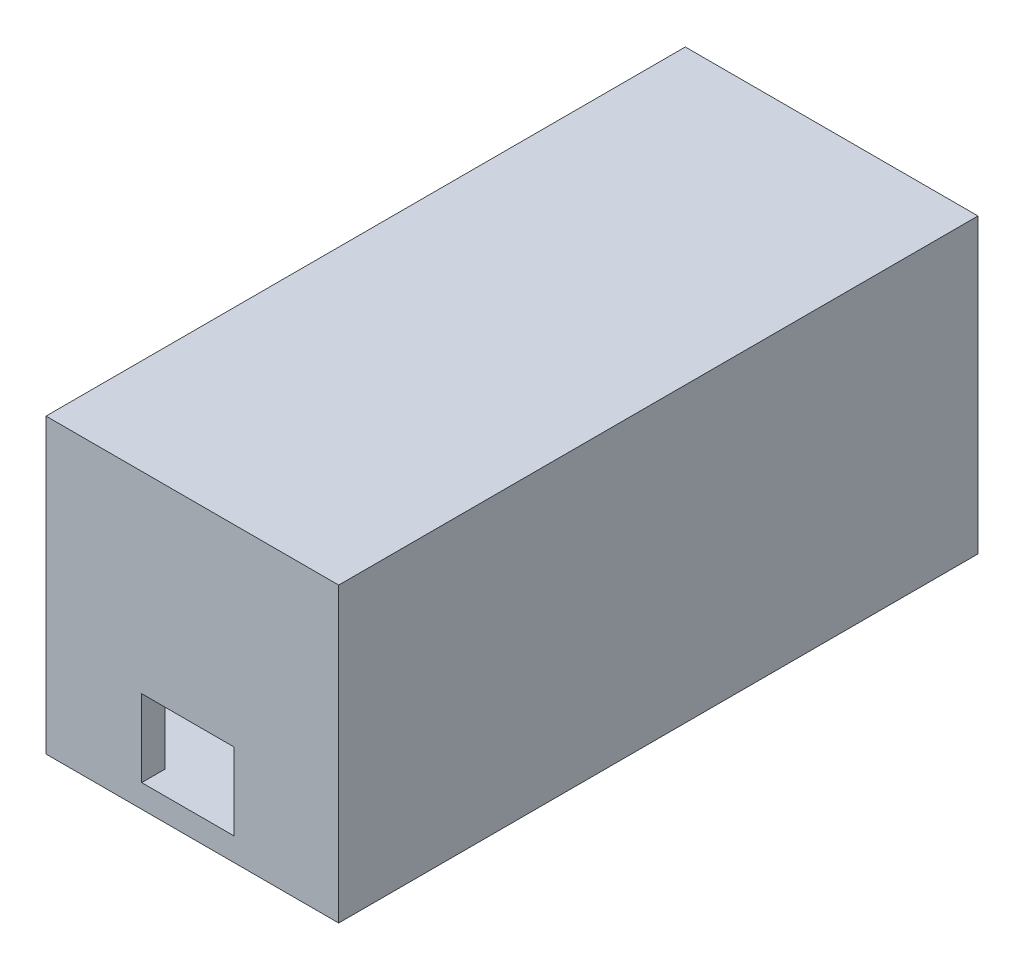
ISO-10303-21;
HEADER;
FILE_DESCRIPTION(('STEP AP214'),'2;1');
FILE_NAME('part.step','',(''),(''),'','','');
FILE_SCHEMA(('AUTOMOTIVE_DESIGN { 1 0 10303 214 1 1 1 1 }'));
ENDSEC;
DATA;
#1=APPLICATION_CONTEXT('core data for automotive mechanical design processes');
#2=APPLICATION_PROTOCOL_DEFINITION('international standard','automotive_design',2000,#1);
#3=PRODUCT_CONTEXT('',#1,'mechanical');
#4=PRODUCT('Part','Part','',(#3));
#5=PRODUCT_RELATED_PRODUCT_CATEGORY('part','',(#4));
#6=PRODUCT_DEFINITION_FORMATION('','',#4);
#7=PRODUCT_DEFINITION_CONTEXT('part definition',#1,'design');
#8=PRODUCT_DEFINITION('design','',#6,#7);
#9=PRODUCT_DEFINITION_SHAPE('','',#8);
#10=(LENGTH_UNIT() NAMED_UNIT(*) SI_UNIT(.MILLI.,.METRE.));
#11=(NAMED_UNIT(*) PLANE_ANGLE_UNIT() SI_UNIT($,.RADIAN.));
#12=(NAMED_UNIT(*) SI_UNIT($,.STERADIAN.) SOLID_ANGLE_UNIT());
#13=UNCERTAINTY_MEASURE_WITH_UNIT(LENGTH_MEASURE(1.E-05),#10,'distance_accuracy_value','');
#14=(GEOMETRIC_REPRESENTATION_CONTEXT(3) GLOBAL_UNCERTAINTY_ASSIGNED_CONTEXT((#13)) GLOBAL_UNIT_ASSIGNED_CONTEXT((#10,
#11,#12)) REPRESENTATION_CONTEXT('',''));
#15=CARTESIAN_POINT('',(0.,0.,0.));
#16=DIRECTION('',(0.,0.,1.));
#17=DIRECTION('',(1.,0.,0.));
#18=AXIS2_PLACEMENT_3D('',#15,#16,#17);
#19=CARTESIAN_POINT('',(0.,0.,0.));
#20=DIRECTION('',(0.,0.,-1.));
#21=DIRECTION('',(-1.,0.,0.));
#22=AXIS2_PLACEMENT_3D('',#19,#20,#21);
#23=PLANE('',#22);
#24=DIRECTION('',(0.,-1.,0.));
#25=VECTOR('',#24,1.);
#26=CARTESIAN_POINT('',(0.,0.,0.));
#27=LINE('',#26,#25);
#28=CARTESIAN_POINT('',(0.,19.,0.));
#29=VERTEX_POINT('',#28);
#30=CARTESIAN_POINT('',(0.,0.,0.));
#31=VERTEX_POINT('',#30);
#32=EDGE_CURVE('E210',#29,#31,#27,.T.);
#33=ORIENTED_EDGE('',*,*,#32,.F.);
#34=DIRECTION('',(-1.,0.,0.));
#35=VECTOR('',#34,1.);
#36=CARTESIAN_POINT('',(0.,19.,0.));
#37=LINE('',#36,#35);
#38=CARTESIAN_POINT('',(19.,19.,0.));
#39=VERTEX_POINT('',#38);
#40=EDGE_CURVE('E58',#39,#29,#37,.T.);
#41=ORIENTED_EDGE('',*,*,#40,.F.);
#42=DIRECTION('',(0.,1.,0.));
#43=VECTOR('',#42,1.);
#44=CARTESIAN_POINT('',(19.,0.,0.));
#45=LINE('',#44,#43);
#46=CARTESIAN_POINT('',(19.,0.,0.));
#47=VERTEX_POINT('',#46);
#48=EDGE_CURVE('E215',#47,#39,#45,.T.);
#49=ORIENTED_EDGE('',*,*,#48,.F.);
#50=DIRECTION('',(1.,0.,0.));
#51=VECTOR('',#50,1.);
#52=CARTESIAN_POINT('',(0.,0.,0.));
#53=LINE('',#52,#51);
#54=EDGE_CURVE('E213',#31,#47,#53,.T.);
#55=ORIENTED_EDGE('',*,*,#54,.F.);
#56=EDGE_LOOP('',(#33,#41,#49,#55));
#57=FACE_BOUND('',#56,.T.);
#58=DIRECTION('',(-1.,0.,0.));
#59=VECTOR('',#58,1.);
#60=CARTESIAN_POINT('',(1.5,17.5,0.));
#61=LINE('',#60,#59);
#62=CARTESIAN_POINT('',(17.5,17.5,0.));
#63=VERTEX_POINT('',#62);
#64=CARTESIAN_POINT('',(1.5,17.5,0.));
#65=VERTEX_POINT('',#64);
#66=EDGE_CURVE('E185',#63,#65,#61,.T.);
#67=ORIENTED_EDGE('',*,*,#66,.T.);
#68=DIRECTION('',(0.,-1.,0.));
#69=VECTOR('',#68,1.);
#70=CARTESIAN_POINT('',(1.5,1.5,0.));
#71=LINE('',#70,#69);
#72=CARTESIAN_POINT('',(1.5,1.5,0.));
#73=VERTEX_POINT('',#72);
#74=EDGE_CURVE('E50',#65,#73,#71,.T.);
#75=ORIENTED_EDGE('',*,*,#74,.T.);
#76=DIRECTION('',(1.,0.,0.));
#77=VECTOR('',#76,1.);
#78=CARTESIAN_POINT('',(1.5,1.5,0.));
#79=LINE('',#78,#77);
#80=CARTESIAN_POINT('',(17.5,1.5,0.));
#81=VERTEX_POINT('',#80);
#82=EDGE_CURVE('E195',#73,#81,#79,.T.);
#83=ORIENTED_EDGE('',*,*,#82,.T.);
#84=DIRECTION('',(0.,1.,0.));
#85=VECTOR('',#84,1.);
#86=CARTESIAN_POINT('',(17.5,1.5,0.));
#87=LINE('',#86,#85);
#88=EDGE_CURVE('E198',#81,#63,#87,.T.);
#89=ORIENTED_EDGE('',*,*,#88,.T.);
#90=EDGE_LOOP('',(#67,#75,#83,#89));
#91=FACE_BOUND('',#90,.T.);
#92=ADVANCED_FACE('F35',(#57,#91),#23,.T.);
#93=CARTESIAN_POINT('',(0.,0.,40.));
#94=DIRECTION('',(1.,0.,0.));
#95=DIRECTION('',(0.,1.,0.));
#96=AXIS2_PLACEMENT_3D('',#93,#94,#95);
#97=PLANE('',#96);
#98=ORIENTED_EDGE('',*,*,#32,.T.);
#99=DIRECTION('',(0.,0.,-1.));
#100=VECTOR('',#99,1.);
#101=CARTESIAN_POINT('',(0.,0.,40.));
#102=LINE('',#101,#100);
#103=CARTESIAN_POINT('',(0.,0.,41.5));
#104=VERTEX_POINT('',#103);
#105=EDGE_CURVE('E11',#104,#31,#102,.T.);
#106=ORIENTED_EDGE('',*,*,#105,.F.);
#107=DIRECTION('',(0.,-1.,0.));
#108=VECTOR('',#107,1.);
#109=CARTESIAN_POINT('',(0.,19.,41.5));
#110=LINE('',#109,#108);
#111=CARTESIAN_POINT('',(0.,19.,41.5));
#112=VERTEX_POINT('',#111);
#113=EDGE_CURVE('E147',#112,#104,#110,.T.);
#114=ORIENTED_EDGE('',*,*,#113,.F.);
#115=DIRECTION('',(0.,0.,-1.));
#116=VECTOR('',#115,1.);
#117=CARTESIAN_POINT('',(0.,19.,40.));
#118=LINE('',#117,#116);
#119=EDGE_CURVE('E218',#112,#29,#118,.T.);
#120=ORIENTED_EDGE('',*,*,#119,.T.);
#121=EDGE_LOOP('',(#98,#106,#114,#120));
#122=FACE_BOUND('',#121,.T.);
#123=ADVANCED_FACE('F37',(#122),#97,.F.);
#124=CARTESIAN_POINT('',(0.,0.,40.));
#125=DIRECTION('',(0.,1.,0.));
#126=DIRECTION('',(0.,0.,1.));
#127=AXIS2_PLACEMENT_3D('',#124,#125,#126);
#128=PLANE('',#127);
#129=ORIENTED_EDGE('',*,*,#54,.T.);
#130=DIRECTION('',(0.,0.,-1.));
#131=VECTOR('',#130,1.);
#132=CARTESIAN_POINT('',(19.,0.,40.));
#133=LINE('',#132,#131);
#134=CARTESIAN_POINT('',(19.,0.,41.5));
#135=VERTEX_POINT('',#134);
#136=EDGE_CURVE('E43',#135,#47,#133,.T.);
#137=ORIENTED_EDGE('',*,*,#136,.F.);
#138=DIRECTION('',(1.,0.,0.));
#139=VECTOR('',#138,1.);
#140=CARTESIAN_POINT('',(0.,0.,41.5));
#141=LINE('',#140,#139);
#142=EDGE_CURVE('E172',#104,#135,#141,.T.);
#143=ORIENTED_EDGE('',*,*,#142,.F.);
#144=ORIENTED_EDGE('',*,*,#105,.T.);
#145=EDGE_LOOP('',(#129,#137,#143,#144));
#146=FACE_BOUND('',#145,.T.);
#147=ADVANCED_FACE('F236',(#146),#128,.F.);
#148=CARTESIAN_POINT('',(19.,0.,40.));
#149=DIRECTION('',(-1.,0.,0.));
#150=DIRECTION('',(0.,-1.,0.));
#151=AXIS2_PLACEMENT_3D('',#148,#149,#150);
#152=PLANE('',#151);
#153=ORIENTED_EDGE('',*,*,#48,.T.);
#154=DIRECTION('',(0.,0.,-1.));
#155=VECTOR('',#154,1.);
#156=CARTESIAN_POINT('',(19.,19.,40.));
#157=LINE('',#156,#155);
#158=CARTESIAN_POINT('',(19.,19.,41.5));
#159=VERTEX_POINT('',#158);
#160=EDGE_CURVE('E220',#159,#39,#157,.T.);
#161=ORIENTED_EDGE('',*,*,#160,.F.);
#162=DIRECTION('',(0.,1.,0.));
#163=VECTOR('',#162,1.);
#164=CARTESIAN_POINT('',(19.,19.,41.5));
#165=LINE('',#164,#163);
#166=EDGE_CURVE('E175',#135,#159,#165,.T.);
#167=ORIENTED_EDGE('',*,*,#166,.F.);
#168=ORIENTED_EDGE('',*,*,#136,.T.);
#169=EDGE_LOOP('',(#153,#161,#167,#168));
#170=FACE_BOUND('',#169,.T.);
#171=ADVANCED_FACE('F225',(#170),#152,.F.);
#172=CARTESIAN_POINT('',(0.,19.,40.));
#173=DIRECTION('',(0.,-1.,0.));
#174=DIRECTION('',(0.,0.,-1.));
#175=AXIS2_PLACEMENT_3D('',#172,#173,#174);
#176=PLANE('',#175);
#177=ORIENTED_EDGE('',*,*,#40,.T.);
#178=ORIENTED_EDGE('',*,*,#119,.F.);
#179=DIRECTION('',(-1.,0.,0.));
#180=VECTOR('',#179,1.);
#181=CARTESIAN_POINT('',(0.,19.,41.5));
#182=LINE('',#181,#180);
#183=EDGE_CURVE('E178',#159,#112,#182,.T.);
#184=ORIENTED_EDGE('',*,*,#183,.F.);
#185=ORIENTED_EDGE('',*,*,#160,.T.);
#186=EDGE_LOOP('',(#177,#178,#184,#185));
#187=FACE_BOUND('',#186,.T.);
#188=ADVANCED_FACE('F234',(#187),#176,.F.);
#189=CARTESIAN_POINT('',(1.5,1.5,40.));
#190=DIRECTION('',(1.,0.,0.));
#191=DIRECTION('',(0.,0.,-1.));
#192=AXIS2_PLACEMENT_3D('',#189,#190,#191);
#193=PLANE('',#192);
#194=ORIENTED_EDGE('',*,*,#74,.F.);
#195=DIRECTION('',(0.,0.,-1.));
#196=VECTOR('',#195,1.);
#197=CARTESIAN_POINT('',(1.5,17.5,40.));
#198=LINE('',#197,#196);
#199=CARTESIAN_POINT('',(1.5,17.5,40.));
#200=VERTEX_POINT('',#199);
#201=EDGE_CURVE('E193',#200,#65,#198,.T.);
#202=ORIENTED_EDGE('',*,*,#201,.F.);
#203=DIRECTION('',(0.,-1.,0.));
#204=VECTOR('',#203,1.);
#205=CARTESIAN_POINT('',(1.5,1.5,40.));
#206=LINE('',#205,#204);
#207=CARTESIAN_POINT('',(1.5,1.5,40.));
#208=VERTEX_POINT('',#207);
#209=EDGE_CURVE('E181',#200,#208,#206,.T.);
#210=ORIENTED_EDGE('',*,*,#209,.T.);
#211=DIRECTION('',(0.,0.,-1.));
#212=VECTOR('',#211,1.);
#213=CARTESIAN_POINT('',(1.5,1.5,40.));
#214=LINE('',#213,#212);
#215=EDGE_CURVE('E208',#208,#73,#214,.T.);
#216=ORIENTED_EDGE('',*,*,#215,.T.);
#217=EDGE_LOOP('',(#194,#202,#210,#216));
#218=FACE_BOUND('',#217,.T.);
#219=ADVANCED_FACE('F249',(#218),#193,.T.);
#220=CARTESIAN_POINT('',(1.5,1.5,40.));
#221=DIRECTION('',(0.,1.,0.));
#222=DIRECTION('',(0.,0.,1.));
#223=AXIS2_PLACEMENT_3D('',#220,#221,#222);
#224=PLANE('',#223);
#225=ORIENTED_EDGE('',*,*,#82,.F.);
#226=ORIENTED_EDGE('',*,*,#215,.F.);
#227=DIRECTION('',(1.,0.,0.));
#228=VECTOR('',#227,1.);
#229=CARTESIAN_POINT('',(1.5,1.5,40.));
#230=LINE('',#229,#228);
#231=CARTESIAN_POINT('',(6.21099258066499,1.5,40.));
#232=VERTEX_POINT('',#231);
#233=EDGE_CURVE('E146',#208,#232,#230,.T.);
#234=ORIENTED_EDGE('',*,*,#233,.T.);
#235=DIRECTION('',(0.,0.,-1.));
#236=VECTOR('',#235,1.);
#237=CARTESIAN_POINT('',(6.21099258066499,1.5,41.5));
#238=LINE('',#237,#236);
#239=CARTESIAN_POINT('',(6.21099258066499,1.5,41.5));
#240=VERTEX_POINT('',#239);
#241=EDGE_CURVE('E130',#240,#232,#238,.T.);
#242=ORIENTED_EDGE('',*,*,#241,.F.);
#243=DIRECTION('',(1.,0.,0.));
#244=VECTOR('',#243,1.);
#245=CARTESIAN_POINT('',(6.21099258066499,1.5,41.5));
#246=LINE('',#245,#244);
#247=CARTESIAN_POINT('',(12.210992580665,1.5,41.5));
#248=VERTEX_POINT('',#247);
#249=EDGE_CURVE('E137',#240,#248,#246,.T.);
#250=ORIENTED_EDGE('',*,*,#249,.T.);
#251=DIRECTION('',(0.,0.,-1.));
#252=VECTOR('',#251,1.);
#253=CARTESIAN_POINT('',(12.210992580665,1.5,41.5));
#254=LINE('',#253,#252);
#255=CARTESIAN_POINT('',(12.210992580665,1.5,40.));
#256=VERTEX_POINT('',#255);
#257=EDGE_CURVE('E148',#248,#256,#254,.T.);
#258=ORIENTED_EDGE('',*,*,#257,.T.);
#259=CARTESIAN_POINT('',(17.5,1.5,40.));
#260=VERTEX_POINT('',#259);
#261=EDGE_CURVE('E184',#256,#260,#230,.T.);
#262=ORIENTED_EDGE('',*,*,#261,.T.);
#263=DIRECTION('',(0.,0.,-1.));
#264=VECTOR('',#263,1.);
#265=CARTESIAN_POINT('',(17.5,1.5,40.));
#266=LINE('',#265,#264);
#267=EDGE_CURVE('E206',#260,#81,#266,.T.);
#268=ORIENTED_EDGE('',*,*,#267,.T.);
#269=EDGE_LOOP('',(#225,#226,#234,#242,#250,#258,#262,#268));
#270=FACE_BOUND('',#269,.T.);
#271=ADVANCED_FACE('F142',(#270),#224,.T.);
#272=CARTESIAN_POINT('',(17.5,1.5,40.));
#273=DIRECTION('',(-1.,0.,0.));
#274=DIRECTION('',(0.,0.,1.));
#275=AXIS2_PLACEMENT_3D('',#272,#273,#274);
#276=PLANE('',#275);
#277=ORIENTED_EDGE('',*,*,#88,.F.);
#278=ORIENTED_EDGE('',*,*,#267,.F.);
#279=DIRECTION('',(0.,1.,0.));
#280=VECTOR('',#279,1.);
#281=CARTESIAN_POINT('',(17.5,1.5,40.));
#282=LINE('',#281,#280);
#283=CARTESIAN_POINT('',(17.5,17.5,40.));
#284=VERTEX_POINT('',#283);
#285=EDGE_CURVE('E187',#260,#284,#282,.T.);
#286=ORIENTED_EDGE('',*,*,#285,.T.);
#287=DIRECTION('',(0.,0.,-1.));
#288=VECTOR('',#287,1.);
#289=CARTESIAN_POINT('',(17.5,17.5,40.));
#290=LINE('',#289,#288);
#291=EDGE_CURVE('E204',#284,#63,#290,.T.);
#292=ORIENTED_EDGE('',*,*,#291,.T.);
#293=EDGE_LOOP('',(#277,#278,#286,#292));
#294=FACE_BOUND('',#293,.T.);
#295=ADVANCED_FACE('F258',(#294),#276,.T.);
#296=CARTESIAN_POINT('',(1.5,17.5,40.));
#297=DIRECTION('',(0.,-1.,0.));
#298=DIRECTION('',(0.,0.,-1.));
#299=AXIS2_PLACEMENT_3D('',#296,#297,#298);
#300=PLANE('',#299);
#301=ORIENTED_EDGE('',*,*,#66,.F.);
#302=ORIENTED_EDGE('',*,*,#291,.F.);
#303=DIRECTION('',(-1.,0.,0.));
#304=VECTOR('',#303,1.);
#305=CARTESIAN_POINT('',(1.5,17.5,40.));
#306=LINE('',#305,#304);
#307=EDGE_CURVE('E190',#284,#200,#306,.T.);
#308=ORIENTED_EDGE('',*,*,#307,.T.);
#309=ORIENTED_EDGE('',*,*,#201,.T.);
#310=EDGE_LOOP('',(#301,#302,#308,#309));
#311=FACE_BOUND('',#310,.T.);
#312=ADVANCED_FACE('F262',(#311),#300,.T.);
#313=CARTESIAN_POINT('',(0.,0.,41.5));
#314=DIRECTION('',(0.,0.,1.));
#315=DIRECTION('',(1.,0.,0.));
#316=AXIS2_PLACEMENT_3D('',#313,#314,#315);
#317=PLANE('',#316);
#318=ORIENTED_EDGE('',*,*,#113,.T.);
#319=ORIENTED_EDGE('',*,*,#142,.T.);
#320=ORIENTED_EDGE('',*,*,#166,.T.);
#321=ORIENTED_EDGE('',*,*,#183,.T.);
#322=EDGE_LOOP('',(#318,#319,#320,#321));
#323=FACE_BOUND('',#322,.T.);
#324=ORIENTED_EDGE('',*,*,#249,.F.);
#325=DIRECTION('',(0.,-1.,0.));
#326=VECTOR('',#325,1.);
#327=CARTESIAN_POINT('',(6.21099258066499,6.5,41.5));
#328=LINE('',#327,#326);
#329=CARTESIAN_POINT('',(6.21099258066499,6.5,41.5));
#330=VERTEX_POINT('',#329);
#331=EDGE_CURVE('E127',#330,#240,#328,.T.);
#332=ORIENTED_EDGE('',*,*,#331,.F.);
#333=DIRECTION('',(-1.,0.,0.));
#334=VECTOR('',#333,1.);
#335=CARTESIAN_POINT('',(6.21099258066499,6.5,41.5));
#336=LINE('',#335,#334);
#337=CARTESIAN_POINT('',(12.210992580665,6.5,41.5));
#338=VERTEX_POINT('',#337);
#339=EDGE_CURVE('E155',#338,#330,#336,.T.);
#340=ORIENTED_EDGE('',*,*,#339,.F.);
#341=DIRECTION('',(0.,1.,0.));
#342=VECTOR('',#341,1.);
#343=CARTESIAN_POINT('',(12.210992580665,6.5,41.5));
#344=LINE('',#343,#342);
#345=EDGE_CURVE('E153',#248,#338,#344,.T.);
#346=ORIENTED_EDGE('',*,*,#345,.F.);
#347=EDGE_LOOP('',(#324,#332,#340,#346));
#348=FACE_BOUND('',#347,.T.);
#349=ADVANCED_FACE('F151',(#323,#348),#317,.T.);
#350=CARTESIAN_POINT('',(0.,0.,40.));
#351=DIRECTION('',(0.,0.,1.));
#352=DIRECTION('',(1.,0.,0.));
#353=AXIS2_PLACEMENT_3D('',#350,#351,#352);
#354=PLANE('',#353);
#355=ORIENTED_EDGE('',*,*,#233,.F.);
#356=ORIENTED_EDGE('',*,*,#209,.F.);
#357=ORIENTED_EDGE('',*,*,#307,.F.);
#358=ORIENTED_EDGE('',*,*,#285,.F.);
#359=ORIENTED_EDGE('',*,*,#261,.F.);
#360=DIRECTION('',(0.,1.,0.));
#361=VECTOR('',#360,1.);
#362=CARTESIAN_POINT('',(12.210992580665,6.5,40.));
#363=LINE('',#362,#361);
#364=CARTESIAN_POINT('',(12.210992580665,6.5,40.));
#365=VERTEX_POINT('',#364);
#366=EDGE_CURVE('E161',#256,#365,#363,.T.);
#367=ORIENTED_EDGE('',*,*,#366,.T.);
#368=DIRECTION('',(-1.,0.,0.));
#369=VECTOR('',#368,1.);
#370=CARTESIAN_POINT('',(6.21099258066499,6.5,40.));
#371=LINE('',#370,#369);
#372=CARTESIAN_POINT('',(6.21099258066499,6.5,40.));
#373=VERTEX_POINT('',#372);
#374=EDGE_CURVE('E138',#365,#373,#371,.T.);
#375=ORIENTED_EDGE('',*,*,#374,.T.);
#376=DIRECTION('',(0.,-1.,0.));
#377=VECTOR('',#376,1.);
#378=CARTESIAN_POINT('',(6.21099258066499,6.5,40.));
#379=LINE('',#378,#377);
#380=EDGE_CURVE('E159',#373,#232,#379,.T.);
#381=ORIENTED_EDGE('',*,*,#380,.T.);
#382=EDGE_LOOP('',(#355,#356,#357,#358,#359,#367,#375,#381));
#383=FACE_BOUND('',#382,.T.);
#384=ADVANCED_FACE('F269',(#383),#354,.F.);
#385=CARTESIAN_POINT('',(6.21099258066499,6.5,41.5));
#386=DIRECTION('',(1.,0.,0.));
#387=DIRECTION('',(0.,0.,-1.));
#388=AXIS2_PLACEMENT_3D('',#385,#386,#387);
#389=PLANE('',#388);
#390=ORIENTED_EDGE('',*,*,#380,.F.);
#391=DIRECTION('',(0.,0.,-1.));
#392=VECTOR('',#391,1.);
#393=CARTESIAN_POINT('',(6.21099258066499,6.5,41.5));
#394=LINE('',#393,#392);
#395=EDGE_CURVE('E133',#330,#373,#394,.T.);
#396=ORIENTED_EDGE('',*,*,#395,.F.);
#397=ORIENTED_EDGE('',*,*,#331,.T.);
#398=ORIENTED_EDGE('',*,*,#241,.T.);
#399=EDGE_LOOP('',(#390,#396,#397,#398));
#400=FACE_BOUND('',#399,.T.);
#401=ADVANCED_FACE('F129',(#400),#389,.T.);
#402=CARTESIAN_POINT('',(12.210992580665,6.5,41.5));
#403=DIRECTION('',(-1.,0.,0.));
#404=DIRECTION('',(0.,0.,1.));
#405=AXIS2_PLACEMENT_3D('',#402,#403,#404);
#406=PLANE('',#405);
#407=ORIENTED_EDGE('',*,*,#366,.F.);
#408=ORIENTED_EDGE('',*,*,#257,.F.);
#409=ORIENTED_EDGE('',*,*,#345,.T.);
#410=DIRECTION('',(0.,0.,-1.));
#411=VECTOR('',#410,1.);
#412=CARTESIAN_POINT('',(12.210992580665,6.5,41.5));
#413=LINE('',#412,#411);
#414=EDGE_CURVE('E167',#338,#365,#413,.T.);
#415=ORIENTED_EDGE('',*,*,#414,.T.);
#416=EDGE_LOOP('',(#407,#408,#409,#415));
#417=FACE_BOUND('',#416,.T.);
#418=ADVANCED_FACE('F277',(#417),#406,.T.);
#419=CARTESIAN_POINT('',(6.21099258066499,6.5,41.5));
#420=DIRECTION('',(0.,-1.,0.));
#421=DIRECTION('',(1.,0.,0.));
#422=AXIS2_PLACEMENT_3D('',#419,#420,#421);
#423=PLANE('',#422);
#424=ORIENTED_EDGE('',*,*,#374,.F.);
#425=ORIENTED_EDGE('',*,*,#414,.F.);
#426=ORIENTED_EDGE('',*,*,#339,.T.);
#427=ORIENTED_EDGE('',*,*,#395,.T.);
#428=EDGE_LOOP('',(#424,#425,#426,#427));
#429=FACE_BOUND('',#428,.T.);
#430=ADVANCED_FACE('F280',(#429),#423,.T.);
#431=CLOSED_SHELL('',(#92,#123,#147,#171,#188,#219,#271,#295,#312,#349,#384,#401,#418,#430));
#432=MANIFOLD_SOLID_BREP('B2',#431);
#433=ADVANCED_BREP_SHAPE_REPRESENTATION('',(#18,#432),#14);
#434=SHAPE_DEFINITION_REPRESENTATION(#9,#433);
ENDSEC;
END-ISO-10303-21;
